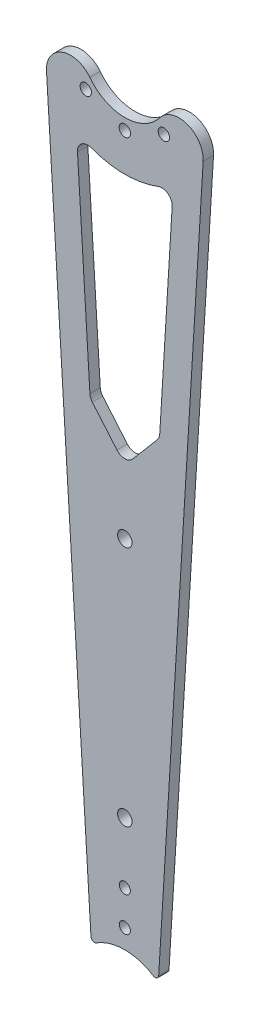
ISO-10303-21;
HEADER;
FILE_DESCRIPTION(('STEP AP214'),'2;1');
FILE_NAME('part.step','',(''),(''),'','','');
FILE_SCHEMA(('AUTOMOTIVE_DESIGN { 1 0 10303 214 1 1 1 1 }'));
ENDSEC;
DATA;
#1=APPLICATION_CONTEXT('core data for automotive mechanical design processes');
#2=APPLICATION_PROTOCOL_DEFINITION('international standard','automotive_design',2000,#1);
#3=PRODUCT_CONTEXT('',#1,'mechanical');
#4=PRODUCT('Part','Part','',(#3));
#5=PRODUCT_RELATED_PRODUCT_CATEGORY('part','',(#4));
#6=PRODUCT_DEFINITION_FORMATION('','',#4);
#7=PRODUCT_DEFINITION_CONTEXT('part definition',#1,'design');
#8=PRODUCT_DEFINITION('design','',#6,#7);
#9=PRODUCT_DEFINITION_SHAPE('','',#8);
#10=(LENGTH_UNIT() NAMED_UNIT(*) SI_UNIT(.MILLI.,.METRE.));
#11=(NAMED_UNIT(*) PLANE_ANGLE_UNIT() SI_UNIT($,.RADIAN.));
#12=(NAMED_UNIT(*) SI_UNIT($,.STERADIAN.) SOLID_ANGLE_UNIT());
#13=UNCERTAINTY_MEASURE_WITH_UNIT(LENGTH_MEASURE(1.E-05),#10,'distance_accuracy_value','');
#14=(GEOMETRIC_REPRESENTATION_CONTEXT(3) GLOBAL_UNCERTAINTY_ASSIGNED_CONTEXT((#13)) GLOBAL_UNIT_ASSIGNED_CONTEXT((#10,
#11,#12)) REPRESENTATION_CONTEXT('',''));
#15=CARTESIAN_POINT('',(0.,0.,0.));
#16=DIRECTION('',(0.,0.,1.));
#17=DIRECTION('',(1.,0.,0.));
#18=AXIS2_PLACEMENT_3D('',#15,#16,#17);
#19=CARTESIAN_POINT('',(15.7106921118465,-11.9681516269959,3.));
#20=DIRECTION('',(0.,0.,-1.));
#21=DIRECTION('',(-1.,0.,0.));
#22=AXIS2_PLACEMENT_3D('',#19,#20,#21);
#23=CYLINDRICAL_SURFACE('',#22,7.);
#24=CARTESIAN_POINT('',(15.7106921118465,-11.9681516269959,0.));
#25=DIRECTION('',(0.,0.,1.));
#26=DIRECTION('',(1.,0.,0.));
#27=AXIS2_PLACEMENT_3D('',#24,#25,#26);
#28=CIRCLE('',#27,7.);
#29=CARTESIAN_POINT('',(10.1423455405592,-7.72627510097201,0.));
#30=VERTEX_POINT('',#29);
#31=CARTESIAN_POINT('',(22.6976357007996,-12.3954914037398,0.));
#32=VERTEX_POINT('',#31);
#33=EDGE_CURVE('E247',#30,#32,#28,.F.);
#34=ORIENTED_EDGE('',*,*,#33,.F.);
#35=DIRECTION('',(0.,0.,-1.));
#36=VECTOR('',#35,1.);
#37=CARTESIAN_POINT('',(10.1423455405592,-7.72627510097201,3.));
#38=LINE('',#37,#36);
#39=CARTESIAN_POINT('',(10.1423455405592,-7.72627510097201,3.));
#40=VERTEX_POINT('',#39);
#41=EDGE_CURVE('E12',#40,#30,#38,.T.);
#42=ORIENTED_EDGE('',*,*,#41,.F.);
#43=CARTESIAN_POINT('',(15.7106921118465,-11.9681516269959,3.));
#44=DIRECTION('',(0.,0.,1.));
#45=DIRECTION('',(1.,0.,0.));
#46=AXIS2_PLACEMENT_3D('',#43,#44,#45);
#47=CIRCLE('',#46,7.);
#48=CARTESIAN_POINT('',(22.6976357007996,-12.3954914037398,3.));
#49=VERTEX_POINT('',#48);
#50=EDGE_CURVE('E265',#40,#49,#47,.F.);
#51=ORIENTED_EDGE('',*,*,#50,.T.);
#52=DIRECTION('',(0.,0.,-1.));
#53=VECTOR('',#52,1.);
#54=CARTESIAN_POINT('',(22.6976357007996,-12.3954914037398,3.));
#55=LINE('',#54,#53);
#56=EDGE_CURVE('E246',#49,#32,#55,.T.);
#57=ORIENTED_EDGE('',*,*,#56,.T.);
#58=EDGE_LOOP('',(#34,#42,#51,#57));
#59=FACE_BOUND('',#58,.T.);
#60=ADVANCED_FACE('F49',(#59),#23,.T.);
#61=CARTESIAN_POINT('',(0.,0.,3.));
#62=DIRECTION('',(0.,0.,-1.));
#63=DIRECTION('',(-1.,0.,0.));
#64=AXIS2_PLACEMENT_3D('',#61,#62,#63);
#65=CYLINDRICAL_SURFACE('',#64,12.75);
#66=CARTESIAN_POINT('',(0.,0.,0.));
#67=DIRECTION('',(0.,0.,1.));
#68=DIRECTION('',(1.,0.,0.));
#69=AXIS2_PLACEMENT_3D('',#66,#67,#68);
#70=CIRCLE('',#69,12.75);
#71=CARTESIAN_POINT('',(-10.1423455405592,-7.72627510097201,0.));
#72=VERTEX_POINT('',#71);
#73=EDGE_CURVE('E249',#72,#30,#70,.T.);
#74=ORIENTED_EDGE('',*,*,#73,.F.);
#75=DIRECTION('',(0.,0.,-1.));
#76=VECTOR('',#75,1.);
#77=CARTESIAN_POINT('',(-10.1423455405592,-7.72627510097201,3.));
#78=LINE('',#77,#76);
#79=CARTESIAN_POINT('',(-10.1423455405592,-7.72627510097201,3.));
#80=VERTEX_POINT('',#79);
#81=EDGE_CURVE('E57',#80,#72,#78,.T.);
#82=ORIENTED_EDGE('',*,*,#81,.F.);
#83=CARTESIAN_POINT('',(0.,0.,3.));
#84=DIRECTION('',(0.,0.,1.));
#85=DIRECTION('',(1.,0.,0.));
#86=AXIS2_PLACEMENT_3D('',#83,#84,#85);
#87=CIRCLE('',#86,12.75);
#88=EDGE_CURVE('E322',#80,#40,#87,.T.);
#89=ORIENTED_EDGE('',*,*,#88,.T.);
#90=ORIENTED_EDGE('',*,*,#41,.T.);
#91=EDGE_LOOP('',(#74,#82,#89,#90));
#92=FACE_BOUND('',#91,.T.);
#93=ADVANCED_FACE('F360',(#92),#65,.F.);
#94=CARTESIAN_POINT('',(-15.7106921118465,-11.9681516269959,3.));
#95=DIRECTION('',(0.,0.,-1.));
#96=DIRECTION('',(-1.,0.,0.));
#97=AXIS2_PLACEMENT_3D('',#94,#95,#96);
#98=CYLINDRICAL_SURFACE('',#97,7.);
#99=CARTESIAN_POINT('',(-15.7106921118465,-11.9681516269959,0.));
#100=DIRECTION('',(0.,0.,1.));
#101=DIRECTION('',(1.,0.,0.));
#102=AXIS2_PLACEMENT_3D('',#99,#100,#101);
#103=CIRCLE('',#102,7.);
#104=CARTESIAN_POINT('',(-22.6976357007996,-12.3954914037398,0.));
#105=VERTEX_POINT('',#104);
#106=EDGE_CURVE('E188',#72,#105,#103,.T.);
#107=ORIENTED_EDGE('',*,*,#106,.T.);
#108=DIRECTION('',(0.,0.,-1.));
#109=VECTOR('',#108,1.);
#110=CARTESIAN_POINT('',(-22.6976357007996,-12.3954914037398,3.));
#111=LINE('',#110,#109);
#112=CARTESIAN_POINT('',(-22.6976357007996,-12.3954914037398,3.));
#113=VERTEX_POINT('',#112);
#114=EDGE_CURVE('E182',#113,#105,#111,.T.);
#115=ORIENTED_EDGE('',*,*,#114,.F.);
#116=CARTESIAN_POINT('',(-15.7106921118465,-11.9681516269959,3.));
#117=DIRECTION('',(0.,0.,1.));
#118=DIRECTION('',(1.,0.,0.));
#119=AXIS2_PLACEMENT_3D('',#116,#117,#118);
#120=CIRCLE('',#119,7.);
#121=EDGE_CURVE('E326',#80,#113,#120,.T.);
#122=ORIENTED_EDGE('',*,*,#121,.F.);
#123=ORIENTED_EDGE('',*,*,#81,.T.);
#124=EDGE_LOOP('',(#107,#115,#122,#123));
#125=FACE_BOUND('',#124,.T.);
#126=ADVANCED_FACE('F363',(#125),#98,.T.);
#127=CARTESIAN_POINT('',(-23.3683585327713,-1.42927003648007,3.));
#128=DIRECTION('',(-0.998134798421867,-0.0610485395348502,0.));
#129=DIRECTION('',(0.0610485395348502,-0.998134798421867,0.));
#130=AXIS2_PLACEMENT_3D('',#127,#128,#129);
#131=PLANE('',#130);
#132=DIRECTION('',(-0.0610485395348502,0.998134798421867,0.));
#133=VECTOR('',#132,1.);
#134=CARTESIAN_POINT('',(-23.3683585327713,-1.42927003648007,0.));
#135=LINE('',#134,#133);
#136=CARTESIAN_POINT('',(-9.80600115634961,-223.171853056214,0.));
#137=VERTEX_POINT('',#136);
#138=EDGE_CURVE('E175',#137,#105,#135,.T.);
#139=ORIENTED_EDGE('',*,*,#138,.F.);
#140=DIRECTION('',(0.,0.,1.));
#141=VECTOR('',#140,1.);
#142=CARTESIAN_POINT('',(-9.80600115634961,-223.171853056214,0.));
#143=LINE('',#142,#141);
#144=CARTESIAN_POINT('',(-9.80600115634961,-223.171853056214,3.));
#145=VERTEX_POINT('',#144);
#146=EDGE_CURVE('E179',#137,#145,#143,.T.);
#147=ORIENTED_EDGE('',*,*,#146,.T.);
#148=DIRECTION('',(-0.0610485395348502,0.998134798421867,0.));
#149=VECTOR('',#148,1.);
#150=CARTESIAN_POINT('',(-23.3683585327713,-1.42927003648007,3.));
#151=LINE('',#150,#149);
#152=EDGE_CURVE('E230',#145,#113,#151,.T.);
#153=ORIENTED_EDGE('',*,*,#152,.T.);
#154=ORIENTED_EDGE('',*,*,#114,.T.);
#155=EDGE_LOOP('',(#139,#147,#153,#154));
#156=FACE_BOUND('',#155,.T.);
#157=ADVANCED_FACE('F177',(#156),#131,.T.);
#158=CARTESIAN_POINT('',(0.,-16.,3.));
#159=DIRECTION('',(0.,0.,-1.));
#160=DIRECTION('',(-1.,0.,0.));
#161=AXIS2_PLACEMENT_3D('',#158,#159,#160);
#162=CYLINDRICAL_SURFACE('',#161,1.65);
#163=CARTESIAN_POINT('',(0.,-16.,3.));
#164=DIRECTION('',(0.,0.,1.));
#165=DIRECTION('',(1.,0.,0.));
#166=AXIS2_PLACEMENT_3D('',#163,#164,#165);
#167=CIRCLE('',#166,1.65);
#168=CARTESIAN_POINT('',(1.65,-16.,3.));
#169=VERTEX_POINT('',#168);
#170=EDGE_CURVE('E237',#169,#169,#167,.T.);
#171=ORIENTED_EDGE('',*,*,#170,.T.);
#172=EDGE_LOOP('',(#171));
#173=FACE_BOUND('',#172,.T.);
#174=CARTESIAN_POINT('',(0.,-16.,0.));
#175=DIRECTION('',(0.,0.,1.));
#176=DIRECTION('',(1.,0.,0.));
#177=AXIS2_PLACEMENT_3D('',#174,#175,#176);
#178=CIRCLE('',#177,1.65);
#179=CARTESIAN_POINT('',(1.65,-16.,0.));
#180=VERTEX_POINT('',#179);
#181=EDGE_CURVE('E259',#180,#180,#178,.T.);
#182=ORIENTED_EDGE('',*,*,#181,.F.);
#183=EDGE_LOOP('',(#182));
#184=FACE_BOUND('',#183,.T.);
#185=ADVANCED_FACE('F375',(#173,#184),#162,.F.);
#186=CARTESIAN_POINT('',(11.3137084989848,-11.3137084989847,3.));
#187=DIRECTION('',(0.,0.,-1.));
#188=DIRECTION('',(-1.,0.,0.));
#189=AXIS2_PLACEMENT_3D('',#186,#187,#188);
#190=CYLINDRICAL_SURFACE('',#189,1.65);
#191=CARTESIAN_POINT('',(11.3137084989848,-11.3137084989847,3.));
#192=DIRECTION('',(0.,0.,1.));
#193=DIRECTION('',(1.,0.,0.));
#194=AXIS2_PLACEMENT_3D('',#191,#192,#193);
#195=CIRCLE('',#194,1.65);
#196=CARTESIAN_POINT('',(12.9637084989848,-11.3137084989847,3.));
#197=VERTEX_POINT('',#196);
#198=EDGE_CURVE('E229',#197,#197,#195,.T.);
#199=ORIENTED_EDGE('',*,*,#198,.T.);
#200=EDGE_LOOP('',(#199));
#201=FACE_BOUND('',#200,.T.);
#202=CARTESIAN_POINT('',(11.3137084989848,-11.3137084989847,0.));
#203=DIRECTION('',(0.,0.,1.));
#204=DIRECTION('',(1.,0.,0.));
#205=AXIS2_PLACEMENT_3D('',#202,#203,#204);
#206=CIRCLE('',#205,1.65);
#207=CARTESIAN_POINT('',(12.9637084989848,-11.3137084989847,0.));
#208=VERTEX_POINT('',#207);
#209=EDGE_CURVE('E256',#208,#208,#206,.T.);
#210=ORIENTED_EDGE('',*,*,#209,.F.);
#211=EDGE_LOOP('',(#210));
#212=FACE_BOUND('',#211,.T.);
#213=ADVANCED_FACE('F379',(#201,#212),#190,.F.);
#214=CARTESIAN_POINT('',(23.3683585327713,-1.42927003648006,3.));
#215=DIRECTION('',(-0.998134798421867,0.0610485395348499,0.));
#216=DIRECTION('',(-0.0610485395348499,-0.998134798421867,0.));
#217=AXIS2_PLACEMENT_3D('',#214,#215,#216);
#218=PLANE('',#217);
#219=DIRECTION('',(0.0610485395348499,0.998134798421867,0.));
#220=VECTOR('',#219,1.);
#221=CARTESIAN_POINT('',(23.3683585327713,-1.42927003648006,0.));
#222=LINE('',#221,#220);
#223=CARTESIAN_POINT('',(9.80600115634961,-223.171853056214,0.));
#224=VERTEX_POINT('',#223);
#225=EDGE_CURVE('E187',#224,#32,#222,.T.);
#226=ORIENTED_EDGE('',*,*,#225,.T.);
#227=ORIENTED_EDGE('',*,*,#56,.F.);
#228=DIRECTION('',(0.0610485395348499,0.998134798421867,0.));
#229=VECTOR('',#228,1.);
#230=CARTESIAN_POINT('',(23.3683585327713,-1.42927003648006,3.));
#231=LINE('',#230,#229);
#232=CARTESIAN_POINT('',(9.80600115634961,-223.171853056214,3.));
#233=VERTEX_POINT('',#232);
#234=EDGE_CURVE('E226',#233,#49,#231,.T.);
#235=ORIENTED_EDGE('',*,*,#234,.F.);
#236=DIRECTION('',(0.,0.,1.));
#237=VECTOR('',#236,1.);
#238=CARTESIAN_POINT('',(9.80600115634961,-223.171853056214,0.));
#239=LINE('',#238,#237);
#240=EDGE_CURVE('E288',#224,#233,#239,.T.);
#241=ORIENTED_EDGE('',*,*,#240,.F.);
#242=EDGE_LOOP('',(#226,#227,#235,#241));
#243=FACE_BOUND('',#242,.T.);
#244=ADVANCED_FACE('F353',(#243),#218,.F.);
#245=CARTESIAN_POINT('',(-11.3137084989848,-11.3137084989847,3.));
#246=DIRECTION('',(0.,0.,-1.));
#247=DIRECTION('',(-1.,0.,0.));
#248=AXIS2_PLACEMENT_3D('',#245,#246,#247);
#249=CYLINDRICAL_SURFACE('',#248,1.65);
#250=CARTESIAN_POINT('',(-11.3137084989848,-11.3137084989847,3.));
#251=DIRECTION('',(0.,0.,1.));
#252=DIRECTION('',(1.,0.,0.));
#253=AXIS2_PLACEMENT_3D('',#250,#251,#252);
#254=CIRCLE('',#253,1.65);
#255=CARTESIAN_POINT('',(-9.66370849898478,-11.3137084989847,3.));
#256=VERTEX_POINT('',#255);
#257=EDGE_CURVE('E241',#256,#256,#254,.T.);
#258=ORIENTED_EDGE('',*,*,#257,.T.);
#259=EDGE_LOOP('',(#258));
#260=FACE_BOUND('',#259,.T.);
#261=CARTESIAN_POINT('',(-11.3137084989848,-11.3137084989847,0.));
#262=DIRECTION('',(0.,0.,1.));
#263=DIRECTION('',(1.,0.,0.));
#264=AXIS2_PLACEMENT_3D('',#261,#262,#263);
#265=CIRCLE('',#264,1.65);
#266=CARTESIAN_POINT('',(-9.66370849898478,-11.3137084989847,0.));
#267=VERTEX_POINT('',#266);
#268=EDGE_CURVE('E262',#267,#267,#265,.T.);
#269=ORIENTED_EDGE('',*,*,#268,.F.);
#270=EDGE_LOOP('',(#269));
#271=FACE_BOUND('',#270,.T.);
#272=ADVANCED_FACE('F378',(#260,#271),#249,.F.);
#273=CARTESIAN_POINT('',(0.,0.,3.));
#274=DIRECTION('',(0.,0.,1.));
#275=DIRECTION('',(1.,0.,0.));
#276=AXIS2_PLACEMENT_3D('',#273,#274,#275);
#277=PLANE('',#276);
#278=CARTESIAN_POINT('',(-1.44115278905475E-13,-188.402692503703,3.));
#279=DIRECTION('',(0.,0.,1.));
#280=DIRECTION('',(1.,0.,0.));
#281=AXIS2_PLACEMENT_3D('',#278,#279,#280);
#282=CIRCLE('',#281,2.1);
#283=CARTESIAN_POINT('',(2.09999999999985,-188.402692503703,3.));
#284=VERTEX_POINT('',#283);
#285=EDGE_CURVE('E276',#284,#284,#282,.T.);
#286=ORIENTED_EDGE('',*,*,#285,.F.);
#287=EDGE_LOOP('',(#286));
#288=FACE_BOUND('',#287,.T.);
#289=CARTESIAN_POINT('',(-1.53124945064269E-13,-118.402692503703,3.));
#290=DIRECTION('',(0.,0.,1.));
#291=DIRECTION('',(1.,0.,0.));
#292=AXIS2_PLACEMENT_3D('',#289,#290,#291);
#293=CIRCLE('',#292,2.1);
#294=CARTESIAN_POINT('',(2.09999999999985,-118.402692503703,3.));
#295=VERTEX_POINT('',#294);
#296=EDGE_CURVE('E282',#295,#295,#293,.T.);
#297=ORIENTED_EDGE('',*,*,#296,.F.);
#298=EDGE_LOOP('',(#297));
#299=FACE_BOUND('',#298,.T.);
#300=CARTESIAN_POINT('',(-7.11929830637525,-86.9145657271247,3.));
#301=DIRECTION('',(0.,0.,1.));
#302=DIRECTION('',(1.,0.,0.));
#303=AXIS2_PLACEMENT_3D('',#300,#301,#302);
#304=CIRCLE('',#303,3.);
#305=CARTESIAN_POINT('',(-10.1137027016408,-87.0977113457292,3.));
#306=VERTEX_POINT('',#305);
#307=CARTESIAN_POINT('',(-9.4118011172847,-88.8496189207016,3.));
#308=VERTEX_POINT('',#307);
#309=EDGE_CURVE('E301',#306,#308,#304,.T.);
#310=ORIENTED_EDGE('',*,*,#309,.F.);
#311=DIRECTION('',(0.06104853953485,-0.998134798421867,0.));
#312=VECTOR('',#311,1.);
#313=CARTESIAN_POINT('',(-15.3832801453964,-0.940881720201261,3.));
#314=LINE('',#313,#312);
#315=CARTESIAN_POINT('',(-13.7159266250711,-28.2018708050899,3.));
#316=VERTEX_POINT('',#315);
#317=EDGE_CURVE('E726',#316,#306,#314,.T.);
#318=ORIENTED_EDGE('',*,*,#317,.F.);
#319=CARTESIAN_POINT('',(-10.7215222298055,-28.0187251864853,3.));
#320=DIRECTION('',(0.,0.,1.));
#321=DIRECTION('',(1.,0.,0.));
#322=AXIS2_PLACEMENT_3D('',#319,#320,#321);
#323=CIRCLE('',#322,3.);
#324=CARTESIAN_POINT('',(-9.64937000682491,-25.2168526678368,3.));
#325=VERTEX_POINT('',#324);
#326=EDGE_CURVE('E745',#325,#316,#323,.T.);
#327=ORIENTED_EDGE('',*,*,#326,.F.);
#328=CARTESIAN_POINT('',(0.,0.,3.));
#329=DIRECTION('',(0.,0.,1.));
#330=DIRECTION('',(1.,0.,0.));
#331=AXIS2_PLACEMENT_3D('',#328,#329,#330);
#332=CIRCLE('',#331,27.);
#333=CARTESIAN_POINT('',(9.64937000682491,-25.2168526678368,3.));
#334=VERTEX_POINT('',#333);
#335=EDGE_CURVE('E749',#334,#325,#332,.F.);
#336=ORIENTED_EDGE('',*,*,#335,.F.);
#337=CARTESIAN_POINT('',(10.7215222298055,-28.0187251864853,3.));
#338=DIRECTION('',(0.,0.,1.));
#339=DIRECTION('',(1.,0.,0.));
#340=AXIS2_PLACEMENT_3D('',#337,#338,#339);
#341=CIRCLE('',#340,3.);
#342=CARTESIAN_POINT('',(13.7159266250711,-28.2018708050899,3.));
#343=VERTEX_POINT('',#342);
#344=EDGE_CURVE('E755',#343,#334,#341,.T.);
#345=ORIENTED_EDGE('',*,*,#344,.F.);
#346=DIRECTION('',(0.06104853953485,0.998134798421867,0.));
#347=VECTOR('',#346,1.);
#348=CARTESIAN_POINT('',(15.3832801453964,-0.940881720201261,3.));
#349=LINE('',#348,#347);
#350=CARTESIAN_POINT('',(10.1137027016408,-87.0977113457292,3.));
#351=VERTEX_POINT('',#350);
#352=EDGE_CURVE('E758',#351,#343,#349,.T.);
#353=ORIENTED_EDGE('',*,*,#352,.F.);
#354=CARTESIAN_POINT('',(7.11929830637525,-86.9145657271247,3.));
#355=DIRECTION('',(0.,0.,1.));
#356=DIRECTION('',(1.,0.,0.));
#357=AXIS2_PLACEMENT_3D('',#354,#355,#356);
#358=CIRCLE('',#357,3.);
#359=CARTESIAN_POINT('',(9.4118011172847,-88.8496189207016,3.));
#360=VERTEX_POINT('',#359);
#361=EDGE_CURVE('E762',#360,#351,#358,.T.);
#362=ORIENTED_EDGE('',*,*,#361,.F.);
#363=DIRECTION('',(0.645017731192305,0.764167603636487,0.));
#364=VECTOR('',#363,1.);
#365=CARTESIAN_POINT('',(49.2901653948268,-41.6047873552469,3.));
#366=LINE('',#365,#364);
#367=CARTESIAN_POINT('',(2.29250281090946,-97.2840182608557,3.));
#368=VERTEX_POINT('',#367);
#369=EDGE_CURVE('E766',#368,#360,#366,.T.);
#370=ORIENTED_EDGE('',*,*,#369,.F.);
#371=CARTESIAN_POINT('',(0.,-95.3489650672788,3.));
#372=DIRECTION('',(0.,0.,1.));
#373=DIRECTION('',(1.,0.,0.));
#374=AXIS2_PLACEMENT_3D('',#371,#372,#373);
#375=CIRCLE('',#374,3.);
#376=CARTESIAN_POINT('',(-2.29250281090949,-97.2840182608557,3.));
#377=VERTEX_POINT('',#376);
#378=EDGE_CURVE('E769',#377,#368,#375,.T.);
#379=ORIENTED_EDGE('',*,*,#378,.F.);
#380=DIRECTION('',(0.645017731192304,-0.764167603636488,0.));
#381=VECTOR('',#380,1.);
#382=CARTESIAN_POINT('',(-49.2901653948268,-41.6047873552468,3.));
#383=LINE('',#382,#381);
#384=EDGE_CURVE('E307',#308,#377,#383,.T.);
#385=ORIENTED_EDGE('',*,*,#384,.F.);
#386=EDGE_LOOP('',(#310,#318,#327,#336,#345,#353,#362,#370,#379,#385));
#387=FACE_BOUND('',#386,.T.);
#388=CARTESIAN_POINT('',(0.,-216.,3.));
#389=DIRECTION('',(0.,0.,1.));
#390=DIRECTION('',(1.,0.,0.));
#391=AXIS2_PLACEMENT_3D('',#388,#389,#390);
#392=CIRCLE('',#391,1.6);
#393=CARTESIAN_POINT('',(1.6,-216.,3.));
#394=VERTEX_POINT('',#393);
#395=EDGE_CURVE('E272',#394,#394,#392,.T.);
#396=ORIENTED_EDGE('',*,*,#395,.F.);
#397=EDGE_LOOP('',(#396));
#398=FACE_BOUND('',#397,.T.);
#399=CARTESIAN_POINT('',(0.,-206.,3.));
#400=DIRECTION('',(0.,0.,1.));
#401=DIRECTION('',(1.,0.,0.));
#402=AXIS2_PLACEMENT_3D('',#399,#400,#401);
#403=CIRCLE('',#402,1.6);
#404=CARTESIAN_POINT('',(1.6,-206.,3.));
#405=VERTEX_POINT('',#404);
#406=EDGE_CURVE('E306',#405,#405,#403,.T.);
#407=ORIENTED_EDGE('',*,*,#406,.F.);
#408=EDGE_LOOP('',(#407));
#409=FACE_BOUND('',#408,.T.);
#410=ORIENTED_EDGE('',*,*,#50,.F.);
#411=ORIENTED_EDGE('',*,*,#88,.F.);
#412=ORIENTED_EDGE('',*,*,#121,.T.);
#413=ORIENTED_EDGE('',*,*,#152,.F.);
#414=CARTESIAN_POINT('',(-8.80786635792774,-223.110804516679,3.));
#415=DIRECTION('',(0.,0.,1.));
#416=DIRECTION('',(1.,0.,0.));
#417=AXIS2_PLACEMENT_3D('',#414,#415,#416);
#418=CIRCLE('',#417,1.00000000000331);
#419=CARTESIAN_POINT('',(-8.27405627562728,-223.956408913569,3.));
#420=VERTEX_POINT('',#419);
#421=EDGE_CURVE('E195',#145,#420,#418,.T.);
#422=ORIENTED_EDGE('',*,*,#421,.T.);
#423=CARTESIAN_POINT('',(-6.60582699651968E-12,-237.063277065335,3.));
#424=DIRECTION('',(0.,0.,1.));
#425=DIRECTION('',(1.,0.,0.));
#426=AXIS2_PLACEMENT_3D('',#423,#424,#425);
#427=CIRCLE('',#426,15.4999999999969);
#428=CARTESIAN_POINT('',(8.27405627562349,-223.956408913575,3.));
#429=VERTEX_POINT('',#428);
#430=EDGE_CURVE('E209',#429,#420,#427,.T.);
#431=ORIENTED_EDGE('',*,*,#430,.F.);
#432=CARTESIAN_POINT('',(8.80786635792774,-223.110804516679,3.));
#433=DIRECTION('',(0.,0.,1.));
#434=DIRECTION('',(1.,0.,0.));
#435=AXIS2_PLACEMENT_3D('',#432,#433,#434);
#436=CIRCLE('',#435,1.00000000000331);
#437=EDGE_CURVE('E205',#233,#429,#436,.F.);
#438=ORIENTED_EDGE('',*,*,#437,.F.);
#439=ORIENTED_EDGE('',*,*,#234,.T.);
#440=EDGE_LOOP('',(#410,#411,#412,#413,#422,#431,#438,#439));
#441=FACE_BOUND('',#440,.T.);
#442=ORIENTED_EDGE('',*,*,#198,.F.);
#443=EDGE_LOOP('',(#442));
#444=FACE_BOUND('',#443,.T.);
#445=ORIENTED_EDGE('',*,*,#170,.F.);
#446=EDGE_LOOP('',(#445));
#447=FACE_BOUND('',#446,.T.);
#448=ORIENTED_EDGE('',*,*,#257,.F.);
#449=EDGE_LOOP('',(#448));
#450=FACE_BOUND('',#449,.T.);
#451=ADVANCED_FACE('F334',(#288,#299,#387,#398,#409,#441,#444,#447,#450),#277,.T.);
#452=CARTESIAN_POINT('',(0.,0.,0.));
#453=DIRECTION('',(0.,0.,1.));
#454=DIRECTION('',(1.,0.,0.));
#455=AXIS2_PLACEMENT_3D('',#452,#453,#454);
#456=PLANE('',#455);
#457=CARTESIAN_POINT('',(-1.44115278905475E-13,-188.402692503703,0.));
#458=DIRECTION('',(0.,0.,1.));
#459=DIRECTION('',(1.,0.,0.));
#460=AXIS2_PLACEMENT_3D('',#457,#458,#459);
#461=CIRCLE('',#460,2.1);
#462=CARTESIAN_POINT('',(2.09999999999985,-188.402692503703,0.));
#463=VERTEX_POINT('',#462);
#464=EDGE_CURVE('E52',#463,#463,#461,.T.);
#465=ORIENTED_EDGE('',*,*,#464,.T.);
#466=EDGE_LOOP('',(#465));
#467=FACE_BOUND('',#466,.T.);
#468=CARTESIAN_POINT('',(-1.53124945064269E-13,-118.402692503703,0.));
#469=DIRECTION('',(0.,0.,1.));
#470=DIRECTION('',(1.,0.,0.));
#471=AXIS2_PLACEMENT_3D('',#468,#469,#470);
#472=CIRCLE('',#471,2.1);
#473=CARTESIAN_POINT('',(2.09999999999985,-118.402692503703,0.));
#474=VERTEX_POINT('',#473);
#475=EDGE_CURVE('E274',#474,#474,#472,.T.);
#476=ORIENTED_EDGE('',*,*,#475,.T.);
#477=EDGE_LOOP('',(#476));
#478=FACE_BOUND('',#477,.T.);
#479=DIRECTION('',(-0.06104853953485,0.998134798421867,0.));
#480=VECTOR('',#479,1.);
#481=CARTESIAN_POINT('',(-13.7159266250711,-28.2018708050899,0.));
#482=LINE('',#481,#480);
#483=CARTESIAN_POINT('',(-10.1137027016408,-87.0977113457292,0.));
#484=VERTEX_POINT('',#483);
#485=CARTESIAN_POINT('',(-13.7159266250711,-28.2018708050899,0.));
#486=VERTEX_POINT('',#485);
#487=EDGE_CURVE('E689',#484,#486,#482,.T.);
#488=ORIENTED_EDGE('',*,*,#487,.F.);
#489=CARTESIAN_POINT('',(-7.11929830637525,-86.9145657271247,0.));
#490=DIRECTION('',(0.,0.,-1.));
#491=DIRECTION('',(-1.,0.,0.));
#492=AXIS2_PLACEMENT_3D('',#489,#490,#491);
#493=CIRCLE('',#492,3.);
#494=CARTESIAN_POINT('',(-9.4118011172847,-88.8496189207016,0.));
#495=VERTEX_POINT('',#494);
#496=EDGE_CURVE('E73',#495,#484,#493,.T.);
#497=ORIENTED_EDGE('',*,*,#496,.F.);
#498=DIRECTION('',(-0.645017731192304,0.764167603636488,0.));
#499=VECTOR('',#498,1.);
#500=CARTESIAN_POINT('',(-2.29250281090949,-97.2840182608557,0.));
#501=LINE('',#500,#499);
#502=CARTESIAN_POINT('',(-2.29250281090949,-97.2840182608557,0.));
#503=VERTEX_POINT('',#502);
#504=EDGE_CURVE('E720',#503,#495,#501,.T.);
#505=ORIENTED_EDGE('',*,*,#504,.F.);
#506=CARTESIAN_POINT('',(0.,-95.3489650672788,0.));
#507=DIRECTION('',(0.,0.,-1.));
#508=DIRECTION('',(1.,0.,0.));
#509=AXIS2_PLACEMENT_3D('',#506,#507,#508);
#510=CIRCLE('',#509,3.);
#511=CARTESIAN_POINT('',(2.29250281090946,-97.2840182608557,0.));
#512=VERTEX_POINT('',#511);
#513=EDGE_CURVE('E717',#512,#503,#510,.T.);
#514=ORIENTED_EDGE('',*,*,#513,.F.);
#515=DIRECTION('',(-0.645017731192305,-0.764167603636487,0.));
#516=VECTOR('',#515,1.);
#517=CARTESIAN_POINT('',(2.29250281090946,-97.2840182608557,0.));
#518=LINE('',#517,#516);
#519=CARTESIAN_POINT('',(9.4118011172847,-88.8496189207016,0.));
#520=VERTEX_POINT('',#519);
#521=EDGE_CURVE('E714',#520,#512,#518,.T.);
#522=ORIENTED_EDGE('',*,*,#521,.F.);
#523=CARTESIAN_POINT('',(7.11929830637525,-86.9145657271247,0.));
#524=DIRECTION('',(0.,0.,-1.));
#525=DIRECTION('',(-1.,0.,0.));
#526=AXIS2_PLACEMENT_3D('',#523,#524,#525);
#527=CIRCLE('',#526,3.);
#528=CARTESIAN_POINT('',(10.1137027016408,-87.0977113457292,0.));
#529=VERTEX_POINT('',#528);
#530=EDGE_CURVE('E711',#529,#520,#527,.T.);
#531=ORIENTED_EDGE('',*,*,#530,.F.);
#532=DIRECTION('',(-0.0610485395348499,-0.998134798421867,0.));
#533=VECTOR('',#532,1.);
#534=CARTESIAN_POINT('',(13.7159266250711,-28.2018708050899,0.));
#535=LINE('',#534,#533);
#536=CARTESIAN_POINT('',(13.7159266250711,-28.2018708050899,0.));
#537=VERTEX_POINT('',#536);
#538=EDGE_CURVE('E708',#537,#529,#535,.T.);
#539=ORIENTED_EDGE('',*,*,#538,.F.);
#540=CARTESIAN_POINT('',(10.7215222298055,-28.0187251864853,0.));
#541=DIRECTION('',(0.,0.,-1.));
#542=DIRECTION('',(1.,0.,0.));
#543=AXIS2_PLACEMENT_3D('',#540,#541,#542);
#544=CIRCLE('',#543,3.);
#545=CARTESIAN_POINT('',(9.64937000682491,-25.2168526678368,0.));
#546=VERTEX_POINT('',#545);
#547=EDGE_CURVE('E705',#546,#537,#544,.T.);
#548=ORIENTED_EDGE('',*,*,#547,.F.);
#549=CARTESIAN_POINT('',(0.,0.,0.));
#550=DIRECTION('',(0.,0.,1.));
#551=DIRECTION('',(-1.,0.,0.));
#552=AXIS2_PLACEMENT_3D('',#549,#550,#551);
#553=CIRCLE('',#552,27.);
#554=CARTESIAN_POINT('',(-9.64937000682491,-25.2168526678368,0.));
#555=VERTEX_POINT('',#554);
#556=EDGE_CURVE('E700',#555,#546,#553,.T.);
#557=ORIENTED_EDGE('',*,*,#556,.F.);
#558=CARTESIAN_POINT('',(-10.7215222298055,-28.0187251864853,0.));
#559=DIRECTION('',(0.,0.,-1.));
#560=DIRECTION('',(-1.,0.,0.));
#561=AXIS2_PLACEMENT_3D('',#558,#559,#560);
#562=CIRCLE('',#561,3.);
#563=EDGE_CURVE('E698',#486,#555,#562,.T.);
#564=ORIENTED_EDGE('',*,*,#563,.F.);
#565=EDGE_LOOP('',(#488,#497,#505,#514,#522,#531,#539,#548,#557,#564));
#566=FACE_BOUND('',#565,.T.);
#567=CARTESIAN_POINT('',(0.,-216.,0.));
#568=DIRECTION('',(0.,0.,1.));
#569=DIRECTION('',(1.,0.,0.));
#570=AXIS2_PLACEMENT_3D('',#567,#568,#569);
#571=CIRCLE('',#570,1.6);
#572=CARTESIAN_POINT('',(1.6,-216.,0.));
#573=VERTEX_POINT('',#572);
#574=EDGE_CURVE('E250',#573,#573,#571,.T.);
#575=ORIENTED_EDGE('',*,*,#574,.T.);
#576=EDGE_LOOP('',(#575));
#577=FACE_BOUND('',#576,.T.);
#578=CARTESIAN_POINT('',(0.,-206.,0.));
#579=DIRECTION('',(0.,0.,1.));
#580=DIRECTION('',(1.,0.,0.));
#581=AXIS2_PLACEMENT_3D('',#578,#579,#580);
#582=CIRCLE('',#581,1.6);
#583=CARTESIAN_POINT('',(1.6,-206.,0.));
#584=VERTEX_POINT('',#583);
#585=EDGE_CURVE('E269',#584,#584,#582,.T.);
#586=ORIENTED_EDGE('',*,*,#585,.T.);
#587=EDGE_LOOP('',(#586));
#588=FACE_BOUND('',#587,.T.);
#589=ORIENTED_EDGE('',*,*,#33,.T.);
#590=ORIENTED_EDGE('',*,*,#225,.F.);
#591=CARTESIAN_POINT('',(8.80786635792774,-223.110804516679,0.));
#592=DIRECTION('',(0.,0.,1.));
#593=DIRECTION('',(1.,0.,0.));
#594=AXIS2_PLACEMENT_3D('',#591,#592,#593);
#595=CIRCLE('',#594,1.00000000000331);
#596=CARTESIAN_POINT('',(8.27405627562349,-223.956408913575,0.));
#597=VERTEX_POINT('',#596);
#598=EDGE_CURVE('E197',#224,#597,#595,.F.);
#599=ORIENTED_EDGE('',*,*,#598,.T.);
#600=CARTESIAN_POINT('',(-6.60582699651968E-12,-237.063277065335,0.));
#601=DIRECTION('',(0.,0.,1.));
#602=DIRECTION('',(1.,0.,0.));
#603=AXIS2_PLACEMENT_3D('',#600,#601,#602);
#604=CIRCLE('',#603,15.4999999999969);
#605=CARTESIAN_POINT('',(-8.27405627562728,-223.956408913569,0.));
#606=VERTEX_POINT('',#605);
#607=EDGE_CURVE('E203',#597,#606,#604,.T.);
#608=ORIENTED_EDGE('',*,*,#607,.T.);
#609=CARTESIAN_POINT('',(-8.80786635792774,-223.110804516679,0.));
#610=DIRECTION('',(0.,0.,1.));
#611=DIRECTION('',(1.,0.,0.));
#612=AXIS2_PLACEMENT_3D('',#609,#610,#611);
#613=CIRCLE('',#612,1.00000000000331);
#614=EDGE_CURVE('E193',#137,#606,#613,.T.);
#615=ORIENTED_EDGE('',*,*,#614,.F.);
#616=ORIENTED_EDGE('',*,*,#138,.T.);
#617=ORIENTED_EDGE('',*,*,#106,.F.);
#618=ORIENTED_EDGE('',*,*,#73,.T.);
#619=EDGE_LOOP('',(#589,#590,#599,#608,#615,#616,#617,#618));
#620=FACE_BOUND('',#619,.T.);
#621=ORIENTED_EDGE('',*,*,#209,.T.);
#622=EDGE_LOOP('',(#621));
#623=FACE_BOUND('',#622,.T.);
#624=ORIENTED_EDGE('',*,*,#181,.T.);
#625=EDGE_LOOP('',(#624));
#626=FACE_BOUND('',#625,.T.);
#627=ORIENTED_EDGE('',*,*,#268,.T.);
#628=EDGE_LOOP('',(#627));
#629=FACE_BOUND('',#628,.T.);
#630=ADVANCED_FACE('F200',(#467,#478,#566,#577,#588,#620,#623,#626,#629),#456,.F.);
#631=CARTESIAN_POINT('',(0.,-206.,-12.));
#632=DIRECTION('',(0.,0.,1.));
#633=DIRECTION('',(1.,0.,0.));
#634=AXIS2_PLACEMENT_3D('',#631,#632,#633);
#635=CYLINDRICAL_SURFACE('',#634,1.6);
#636=ORIENTED_EDGE('',*,*,#406,.T.);
#637=EDGE_LOOP('',(#636));
#638=FACE_BOUND('',#637,.T.);
#639=ORIENTED_EDGE('',*,*,#585,.F.);
#640=EDGE_LOOP('',(#639));
#641=FACE_BOUND('',#640,.T.);
#642=ADVANCED_FACE('F391',(#638,#641),#635,.F.);
#643=CARTESIAN_POINT('',(0.,-216.,-12.));
#644=DIRECTION('',(0.,0.,1.));
#645=DIRECTION('',(1.,0.,0.));
#646=AXIS2_PLACEMENT_3D('',#643,#644,#645);
#647=CYLINDRICAL_SURFACE('',#646,1.6);
#648=ORIENTED_EDGE('',*,*,#395,.T.);
#649=EDGE_LOOP('',(#648));
#650=FACE_BOUND('',#649,.T.);
#651=ORIENTED_EDGE('',*,*,#574,.F.);
#652=EDGE_LOOP('',(#651));
#653=FACE_BOUND('',#652,.T.);
#654=ADVANCED_FACE('F398',(#650,#653),#647,.F.);
#655=CARTESIAN_POINT('',(-7.11929830637525,-86.9145657271247,15.));
#656=DIRECTION('',(0.,0.,-1.));
#657=DIRECTION('',(-1.,0.,0.));
#658=AXIS2_PLACEMENT_3D('',#655,#656,#657);
#659=CYLINDRICAL_SURFACE('',#658,3.);
#660=ORIENTED_EDGE('',*,*,#309,.T.);
#661=DIRECTION('',(0.,0.,-1.));
#662=VECTOR('',#661,1.);
#663=CARTESIAN_POINT('',(-9.4118011172847,-88.8496189207016,15.));
#664=LINE('',#663,#662);
#665=EDGE_CURVE('E724',#308,#495,#664,.T.);
#666=ORIENTED_EDGE('',*,*,#665,.T.);
#667=ORIENTED_EDGE('',*,*,#496,.T.);
#668=DIRECTION('',(0.,0.,-1.));
#669=VECTOR('',#668,1.);
#670=CARTESIAN_POINT('',(-10.1137027016408,-87.0977113457292,15.));
#671=LINE('',#670,#669);
#672=EDGE_CURVE('E723',#306,#484,#671,.T.);
#673=ORIENTED_EDGE('',*,*,#672,.F.);
#674=EDGE_LOOP('',(#660,#666,#667,#673));
#675=FACE_BOUND('',#674,.T.);
#676=ADVANCED_FACE('F402',(#675),#659,.F.);
#677=CARTESIAN_POINT('',(-2.29250281090949,-97.2840182608557,15.));
#678=DIRECTION('',(-0.764167603636488,-0.645017731192304,0.));
#679=DIRECTION('',(0.645017731192304,-0.764167603636488,0.));
#680=AXIS2_PLACEMENT_3D('',#677,#678,#679);
#681=PLANE('',#680);
#682=ORIENTED_EDGE('',*,*,#384,.T.);
#683=DIRECTION('',(0.,0.,-1.));
#684=VECTOR('',#683,1.);
#685=CARTESIAN_POINT('',(-2.29250281090949,-97.2840182608557,15.));
#686=LINE('',#685,#684);
#687=EDGE_CURVE('E727',#377,#503,#686,.T.);
#688=ORIENTED_EDGE('',*,*,#687,.T.);
#689=ORIENTED_EDGE('',*,*,#504,.T.);
#690=ORIENTED_EDGE('',*,*,#665,.F.);
#691=EDGE_LOOP('',(#682,#688,#689,#690));
#692=FACE_BOUND('',#691,.T.);
#693=ADVANCED_FACE('F406',(#692),#681,.F.);
#694=CARTESIAN_POINT('',(0.,-95.3489650672788,15.));
#695=DIRECTION('',(0.,0.,-1.));
#696=DIRECTION('',(-1.,0.,0.));
#697=AXIS2_PLACEMENT_3D('',#694,#695,#696);
#698=CYLINDRICAL_SURFACE('',#697,3.);
#699=ORIENTED_EDGE('',*,*,#378,.T.);
#700=DIRECTION('',(0.,0.,-1.));
#701=VECTOR('',#700,1.);
#702=CARTESIAN_POINT('',(2.29250281090946,-97.2840182608557,15.));
#703=LINE('',#702,#701);
#704=EDGE_CURVE('E729',#368,#512,#703,.T.);
#705=ORIENTED_EDGE('',*,*,#704,.T.);
#706=ORIENTED_EDGE('',*,*,#513,.T.);
#707=ORIENTED_EDGE('',*,*,#687,.F.);
#708=EDGE_LOOP('',(#699,#705,#706,#707));
#709=FACE_BOUND('',#708,.T.);
#710=ADVANCED_FACE('F434',(#709),#698,.F.);
#711=CARTESIAN_POINT('',(2.29250281090946,-97.2840182608557,15.));
#712=DIRECTION('',(0.764167603636487,-0.645017731192305,0.));
#713=DIRECTION('',(0.645017731192305,0.764167603636487,0.));
#714=AXIS2_PLACEMENT_3D('',#711,#712,#713);
#715=PLANE('',#714);
#716=ORIENTED_EDGE('',*,*,#369,.T.);
#717=DIRECTION('',(0.,0.,-1.));
#718=VECTOR('',#717,1.);
#719=CARTESIAN_POINT('',(9.4118011172847,-88.8496189207016,15.));
#720=LINE('',#719,#718);
#721=EDGE_CURVE('E731',#360,#520,#720,.T.);
#722=ORIENTED_EDGE('',*,*,#721,.T.);
#723=ORIENTED_EDGE('',*,*,#521,.T.);
#724=ORIENTED_EDGE('',*,*,#704,.F.);
#725=EDGE_LOOP('',(#716,#722,#723,#724));
#726=FACE_BOUND('',#725,.T.);
#727=ADVANCED_FACE('F430',(#726),#715,.F.);
#728=CARTESIAN_POINT('',(7.11929830637525,-86.9145657271247,15.));
#729=DIRECTION('',(0.,0.,-1.));
#730=DIRECTION('',(-1.,0.,0.));
#731=AXIS2_PLACEMENT_3D('',#728,#729,#730);
#732=CYLINDRICAL_SURFACE('',#731,3.);
#733=ORIENTED_EDGE('',*,*,#361,.T.);
#734=DIRECTION('',(0.,0.,-1.));
#735=VECTOR('',#734,1.);
#736=CARTESIAN_POINT('',(10.1137027016408,-87.0977113457292,15.));
#737=LINE('',#736,#735);
#738=EDGE_CURVE('E733',#351,#529,#737,.T.);
#739=ORIENTED_EDGE('',*,*,#738,.T.);
#740=ORIENTED_EDGE('',*,*,#530,.T.);
#741=ORIENTED_EDGE('',*,*,#721,.F.);
#742=EDGE_LOOP('',(#733,#739,#740,#741));
#743=FACE_BOUND('',#742,.T.);
#744=ADVANCED_FACE('F426',(#743),#732,.F.);
#745=CARTESIAN_POINT('',(13.7159266250711,-28.2018708050899,15.));
#746=DIRECTION('',(0.998134798421867,-0.06104853953485,0.));
#747=DIRECTION('',(0.06104853953485,0.998134798421867,0.));
#748=AXIS2_PLACEMENT_3D('',#745,#746,#747);
#749=PLANE('',#748);
#750=ORIENTED_EDGE('',*,*,#352,.T.);
#751=DIRECTION('',(0.,0.,-1.));
#752=VECTOR('',#751,1.);
#753=CARTESIAN_POINT('',(13.7159266250711,-28.2018708050899,15.));
#754=LINE('',#753,#752);
#755=EDGE_CURVE('E735',#343,#537,#754,.T.);
#756=ORIENTED_EDGE('',*,*,#755,.T.);
#757=ORIENTED_EDGE('',*,*,#538,.T.);
#758=ORIENTED_EDGE('',*,*,#738,.F.);
#759=EDGE_LOOP('',(#750,#756,#757,#758));
#760=FACE_BOUND('',#759,.T.);
#761=ADVANCED_FACE('F422',(#760),#749,.F.);
#762=CARTESIAN_POINT('',(10.7215222298055,-28.0187251864853,15.));
#763=DIRECTION('',(0.,0.,-1.));
#764=DIRECTION('',(-1.,0.,0.));
#765=AXIS2_PLACEMENT_3D('',#762,#763,#764);
#766=CYLINDRICAL_SURFACE('',#765,3.);
#767=ORIENTED_EDGE('',*,*,#344,.T.);
#768=DIRECTION('',(0.,0.,-1.));
#769=VECTOR('',#768,1.);
#770=CARTESIAN_POINT('',(9.64937000682491,-25.2168526678368,15.));
#771=LINE('',#770,#769);
#772=EDGE_CURVE('E737',#334,#546,#771,.T.);
#773=ORIENTED_EDGE('',*,*,#772,.T.);
#774=ORIENTED_EDGE('',*,*,#547,.T.);
#775=ORIENTED_EDGE('',*,*,#755,.F.);
#776=EDGE_LOOP('',(#767,#773,#774,#775));
#777=FACE_BOUND('',#776,.T.);
#778=ADVANCED_FACE('F418',(#777),#766,.F.);
#779=CARTESIAN_POINT('',(0.,0.,15.));
#780=DIRECTION('',(0.,0.,-1.));
#781=DIRECTION('',(-1.,0.,0.));
#782=AXIS2_PLACEMENT_3D('',#779,#780,#781);
#783=CYLINDRICAL_SURFACE('',#782,27.);
#784=ORIENTED_EDGE('',*,*,#335,.T.);
#785=DIRECTION('',(0.,0.,-1.));
#786=VECTOR('',#785,1.);
#787=CARTESIAN_POINT('',(-9.64937000682491,-25.2168526678368,15.));
#788=LINE('',#787,#786);
#789=EDGE_CURVE('E739',#325,#555,#788,.T.);
#790=ORIENTED_EDGE('',*,*,#789,.T.);
#791=ORIENTED_EDGE('',*,*,#556,.T.);
#792=ORIENTED_EDGE('',*,*,#772,.F.);
#793=EDGE_LOOP('',(#784,#790,#791,#792));
#794=FACE_BOUND('',#793,.T.);
#795=ADVANCED_FACE('F414',(#794),#783,.T.);
#796=CARTESIAN_POINT('',(-10.7215222298055,-28.0187251864853,15.));
#797=DIRECTION('',(0.,0.,-1.));
#798=DIRECTION('',(-1.,0.,0.));
#799=AXIS2_PLACEMENT_3D('',#796,#797,#798);
#800=CYLINDRICAL_SURFACE('',#799,3.);
#801=ORIENTED_EDGE('',*,*,#326,.T.);
#802=DIRECTION('',(0.,0.,-1.));
#803=VECTOR('',#802,1.);
#804=CARTESIAN_POINT('',(-13.7159266250711,-28.2018708050899,15.));
#805=LINE('',#804,#803);
#806=EDGE_CURVE('E65',#316,#486,#805,.T.);
#807=ORIENTED_EDGE('',*,*,#806,.T.);
#808=ORIENTED_EDGE('',*,*,#563,.T.);
#809=ORIENTED_EDGE('',*,*,#789,.F.);
#810=EDGE_LOOP('',(#801,#807,#808,#809));
#811=FACE_BOUND('',#810,.T.);
#812=ADVANCED_FACE('F411',(#811),#800,.F.);
#813=CARTESIAN_POINT('',(-13.7159266250711,-28.2018708050899,15.));
#814=DIRECTION('',(-0.998134798421867,-0.06104853953485,0.));
#815=DIRECTION('',(0.06104853953485,-0.998134798421867,0.));
#816=AXIS2_PLACEMENT_3D('',#813,#814,#815);
#817=PLANE('',#816);
#818=ORIENTED_EDGE('',*,*,#317,.T.);
#819=ORIENTED_EDGE('',*,*,#672,.T.);
#820=ORIENTED_EDGE('',*,*,#487,.T.);
#821=ORIENTED_EDGE('',*,*,#806,.F.);
#822=EDGE_LOOP('',(#818,#819,#820,#821));
#823=FACE_BOUND('',#822,.T.);
#824=ADVANCED_FACE('F407',(#823),#817,.F.);
#825=CARTESIAN_POINT('',(-1.53124945064269E-13,-118.402692503703,-7.));
#826=DIRECTION('',(0.,0.,1.));
#827=DIRECTION('',(1.,0.,0.));
#828=AXIS2_PLACEMENT_3D('',#825,#826,#827);
#829=CYLINDRICAL_SURFACE('',#828,2.1);
#830=ORIENTED_EDGE('',*,*,#296,.T.);
#831=EDGE_LOOP('',(#830));
#832=FACE_BOUND('',#831,.T.);
#833=ORIENTED_EDGE('',*,*,#475,.F.);
#834=EDGE_LOOP('',(#833));
#835=FACE_BOUND('',#834,.T.);
#836=ADVANCED_FACE('F410',(#832,#835),#829,.F.);
#837=CARTESIAN_POINT('',(-1.44115278905475E-13,-188.402692503703,-7.));
#838=DIRECTION('',(0.,0.,1.));
#839=DIRECTION('',(1.,0.,0.));
#840=AXIS2_PLACEMENT_3D('',#837,#838,#839);
#841=CYLINDRICAL_SURFACE('',#840,2.1);
#842=ORIENTED_EDGE('',*,*,#285,.T.);
#843=EDGE_LOOP('',(#842));
#844=FACE_BOUND('',#843,.T.);
#845=ORIENTED_EDGE('',*,*,#464,.F.);
#846=EDGE_LOOP('',(#845));
#847=FACE_BOUND('',#846,.T.);
#848=ADVANCED_FACE('F444',(#844,#847),#841,.F.);
#849=CARTESIAN_POINT('',(8.80786635792774,-223.110804516679,0.));
#850=DIRECTION('',(0.,0.,1.));
#851=DIRECTION('',(1.,0.,0.));
#852=AXIS2_PLACEMENT_3D('',#849,#850,#851);
#853=CYLINDRICAL_SURFACE('',#852,1.00000000000331);
#854=ORIENTED_EDGE('',*,*,#437,.T.);
#855=DIRECTION('',(0.,0.,1.));
#856=VECTOR('',#855,1.);
#857=CARTESIAN_POINT('',(8.27405627562349,-223.956408913575,0.));
#858=LINE('',#857,#856);
#859=EDGE_CURVE('E344',#597,#429,#858,.T.);
#860=ORIENTED_EDGE('',*,*,#859,.F.);
#861=ORIENTED_EDGE('',*,*,#598,.F.);
#862=ORIENTED_EDGE('',*,*,#240,.T.);
#863=EDGE_LOOP('',(#854,#860,#861,#862));
#864=FACE_BOUND('',#863,.T.);
#865=ADVANCED_FACE('F351',(#864),#853,.T.);
#866=CARTESIAN_POINT('',(-6.60582699651968E-12,-237.063277065335,0.));
#867=DIRECTION('',(0.,0.,1.));
#868=DIRECTION('',(1.,0.,0.));
#869=AXIS2_PLACEMENT_3D('',#866,#867,#868);
#870=CYLINDRICAL_SURFACE('',#869,15.4999999999969);
#871=ORIENTED_EDGE('',*,*,#430,.T.);
#872=DIRECTION('',(0.,0.,1.));
#873=VECTOR('',#872,1.);
#874=CARTESIAN_POINT('',(-8.27405627562728,-223.956408913569,0.));
#875=LINE('',#874,#873);
#876=EDGE_CURVE('E196',#606,#420,#875,.T.);
#877=ORIENTED_EDGE('',*,*,#876,.F.);
#878=ORIENTED_EDGE('',*,*,#607,.F.);
#879=ORIENTED_EDGE('',*,*,#859,.T.);
#880=EDGE_LOOP('',(#871,#877,#878,#879));
#881=FACE_BOUND('',#880,.T.);
#882=ADVANCED_FACE('F342',(#881),#870,.F.);
#883=CARTESIAN_POINT('',(-8.80786635792774,-223.110804516679,0.));
#884=DIRECTION('',(0.,0.,1.));
#885=DIRECTION('',(1.,0.,0.));
#886=AXIS2_PLACEMENT_3D('',#883,#884,#885);
#887=CYLINDRICAL_SURFACE('',#886,1.00000000000331);
#888=ORIENTED_EDGE('',*,*,#421,.F.);
#889=ORIENTED_EDGE('',*,*,#146,.F.);
#890=ORIENTED_EDGE('',*,*,#614,.T.);
#891=ORIENTED_EDGE('',*,*,#876,.T.);
#892=EDGE_LOOP('',(#888,#889,#890,#891));
#893=FACE_BOUND('',#892,.T.);
#894=ADVANCED_FACE('F192',(#893),#887,.T.);
#895=CLOSED_SHELL('',(#60,#93,#126,#157,#185,#213,#244,#272,#451,#630,#642,#654,#676,#693,#710,
#727,#744,#761,#778,#795,#812,#824,#836,#848,#865,#882,#894));
#896=MANIFOLD_SOLID_BREP('B2',#895);
#897=ADVANCED_BREP_SHAPE_REPRESENTATION('',(#18,#896),#14);
#898=SHAPE_DEFINITION_REPRESENTATION(#9,#897);
ENDSEC;
END-ISO-10303-21;
